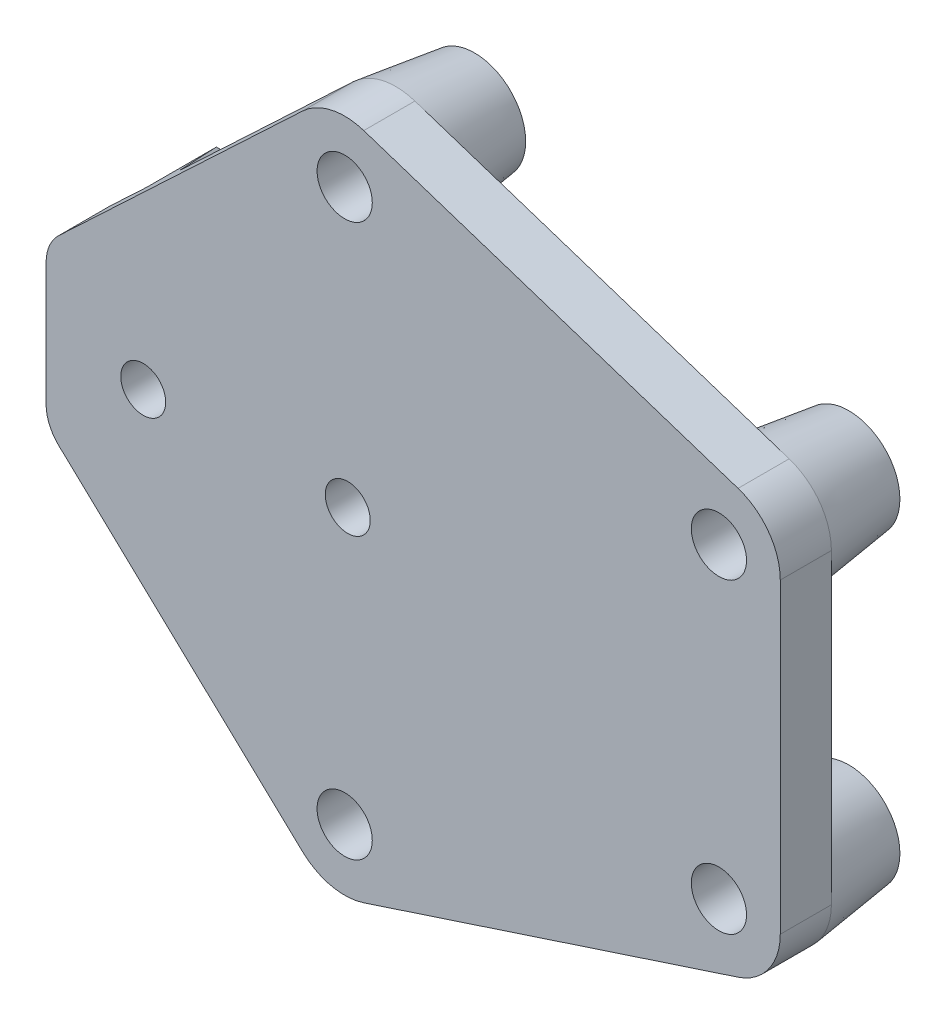
ISO-10303-21;
HEADER;
FILE_DESCRIPTION(('STEP AP214'),'2;1');
FILE_NAME('part.step','',(''),(''),'','','');
FILE_SCHEMA(('AUTOMOTIVE_DESIGN { 1 0 10303 214 1 1 1 1 }'));
ENDSEC;
DATA;
#1=APPLICATION_CONTEXT('core data for automotive mechanical design processes');
#2=APPLICATION_PROTOCOL_DEFINITION('international standard','automotive_design',2000,#1);
#3=PRODUCT_CONTEXT('',#1,'mechanical');
#4=PRODUCT('Part','Part','',(#3));
#5=PRODUCT_RELATED_PRODUCT_CATEGORY('part','',(#4));
#6=PRODUCT_DEFINITION_FORMATION('','',#4);
#7=PRODUCT_DEFINITION_CONTEXT('part definition',#1,'design');
#8=PRODUCT_DEFINITION('design','',#6,#7);
#9=PRODUCT_DEFINITION_SHAPE('','',#8);
#10=(LENGTH_UNIT() NAMED_UNIT(*) SI_UNIT(.MILLI.,.METRE.));
#11=(NAMED_UNIT(*) PLANE_ANGLE_UNIT() SI_UNIT($,.RADIAN.));
#12=(NAMED_UNIT(*) SI_UNIT($,.STERADIAN.) SOLID_ANGLE_UNIT());
#13=UNCERTAINTY_MEASURE_WITH_UNIT(LENGTH_MEASURE(1.E-05),#10,'distance_accuracy_value','');
#14=(GEOMETRIC_REPRESENTATION_CONTEXT(3) GLOBAL_UNCERTAINTY_ASSIGNED_CONTEXT((#13)) GLOBAL_UNIT_ASSIGNED_CONTEXT((#10,
#11,#12)) REPRESENTATION_CONTEXT('',''));
#15=CARTESIAN_POINT('',(0.,0.,0.));
#16=DIRECTION('',(0.,0.,1.));
#17=DIRECTION('',(1.,0.,0.));
#18=AXIS2_PLACEMENT_3D('',#15,#16,#17);
#19=CARTESIAN_POINT('',(0.,0.,0.));
#20=DIRECTION('',(0.,0.,1.));
#21=DIRECTION('',(1.,0.,0.));
#22=AXIS2_PLACEMENT_3D('',#19,#20,#21);
#23=PLANE('',#22);
#24=CARTESIAN_POINT('',(-38.,0.,0.));
#25=DIRECTION('',(0.,0.,1.));
#26=DIRECTION('',(1.,0.,0.));
#27=AXIS2_PLACEMENT_3D('',#24,#25,#26);
#28=CIRCLE('',#27,2.2);
#29=CARTESIAN_POINT('',(-35.8,0.,0.));
#30=VERTEX_POINT('',#29);
#31=EDGE_CURVE('E270',#30,#30,#28,.T.);
#32=ORIENTED_EDGE('',*,*,#31,.T.);
#33=EDGE_LOOP('',(#32));
#34=FACE_BOUND('',#33,.T.);
#35=CARTESIAN_POINT('',(-18.,0.,0.));
#36=DIRECTION('',(0.,0.,1.));
#37=DIRECTION('',(1.,0.,0.));
#38=AXIS2_PLACEMENT_3D('',#35,#36,#37);
#39=CIRCLE('',#38,2.2);
#40=CARTESIAN_POINT('',(-15.8,0.,0.));
#41=VERTEX_POINT('',#40);
#42=EDGE_CURVE('E344',#41,#41,#39,.T.);
#43=ORIENTED_EDGE('',*,*,#42,.T.);
#44=EDGE_LOOP('',(#43));
#45=FACE_BOUND('',#44,.T.);
#46=DIRECTION('',(-0.727760076401564,0.685831809699717,0.));
#47=VECTOR('',#46,1.);
#48=CARTESIAN_POINT('',(-26.1989425971785,-27.8006126232478,0.));
#49=LINE('',#48,#47);
#50=CARTESIAN_POINT('',(-22.4149908581983,-31.3665604584094,0.));
#51=VERTEX_POINT('',#50);
#52=CARTESIAN_POINT('',(-39.4637790615945,-15.3,0.));
#53=VERTEX_POINT('',#52);
#54=EDGE_CURVE('E319',#51,#53,#49,.T.);
#55=ORIENTED_EDGE('',*,*,#54,.T.);
#56=DIRECTION('',(1.,0.,0.));
#57=VECTOR('',#56,1.);
#58=CARTESIAN_POINT('',(-13.,-15.3,0.));
#59=LINE('',#58,#57);
#60=CARTESIAN_POINT('',(-13.,-15.3,0.));
#61=VERTEX_POINT('',#60);
#62=EDGE_CURVE('E183',#53,#61,#59,.T.);
#63=ORIENTED_EDGE('',*,*,#62,.T.);
#64=DIRECTION('',(0.,1.,0.));
#65=VECTOR('',#64,1.);
#66=CARTESIAN_POINT('',(-13.,0.,0.));
#67=LINE('',#66,#65);
#68=CARTESIAN_POINT('',(-13.,-10.3,0.));
#69=VERTEX_POINT('',#68);
#70=EDGE_CURVE('E52',#61,#69,#67,.T.);
#71=ORIENTED_EDGE('',*,*,#70,.T.);
#72=DIRECTION('',(1.,0.,0.));
#73=VECTOR('',#72,1.);
#74=CARTESIAN_POINT('',(0.,-10.3,0.));
#75=LINE('',#74,#73);
#76=CARTESIAN_POINT('',(-42.6471837948346,-10.3,0.));
#77=VERTEX_POINT('',#76);
#78=EDGE_CURVE('E209',#77,#69,#75,.T.);
#79=ORIENTED_EDGE('',*,*,#78,.F.);
#80=DIRECTION('',(0.,1.,0.));
#81=VECTOR('',#80,1.);
#82=CARTESIAN_POINT('',(-42.6471837948345,1.47962141826394E-13,0.));
#83=LINE('',#82,#81);
#84=CARTESIAN_POINT('',(-42.6471837948346,-12.3,0.));
#85=VERTEX_POINT('',#84);
#86=EDGE_CURVE('E212',#85,#77,#83,.T.);
#87=ORIENTED_EDGE('',*,*,#86,.F.);
#88=CARTESIAN_POINT('',(-46.2433272387989,-8.91104030560625,0.));
#89=VERTEX_POINT('',#88);
#90=EDGE_CURVE('E191',#85,#89,#49,.T.);
#91=ORIENTED_EDGE('',*,*,#90,.T.);
#92=CARTESIAN_POINT('',(-43.5,-6.,0.));
#93=DIRECTION('',(0.,0.,1.));
#94=DIRECTION('',(1.,0.,0.));
#95=AXIS2_PLACEMENT_3D('',#92,#93,#94);
#96=CIRCLE('',#95,4.);
#97=CARTESIAN_POINT('',(-47.5,-6.,0.));
#98=VERTEX_POINT('',#97);
#99=EDGE_CURVE('E266',#98,#89,#96,.T.);
#100=ORIENTED_EDGE('',*,*,#99,.F.);
#101=DIRECTION('',(0.,-1.,0.));
#102=VECTOR('',#101,1.);
#103=CARTESIAN_POINT('',(-47.5,0.,0.));
#104=LINE('',#103,#102);
#105=CARTESIAN_POINT('',(-47.5,6.,0.));
#106=VERTEX_POINT('',#105);
#107=EDGE_CURVE('E342',#106,#98,#104,.T.);
#108=ORIENTED_EDGE('',*,*,#107,.F.);
#109=CARTESIAN_POINT('',(-43.5,6.,0.));
#110=DIRECTION('',(0.,0.,1.));
#111=DIRECTION('',(1.,0.,0.));
#112=AXIS2_PLACEMENT_3D('',#109,#110,#111);
#113=CIRCLE('',#112,4.);
#114=CARTESIAN_POINT('',(-46.2433272387989,8.91104030560626,0.));
#115=VERTEX_POINT('',#114);
#116=EDGE_CURVE('E339',#106,#115,#113,.F.);
#117=ORIENTED_EDGE('',*,*,#116,.T.);
#118=DIRECTION('',(-0.727760076401564,-0.685831809699718,0.));
#119=VECTOR('',#118,1.);
#120=CARTESIAN_POINT('',(-26.1989425971786,27.8006126232478,0.));
#121=LINE('',#120,#119);
#122=CARTESIAN_POINT('',(-42.6471837948346,12.3,0.));
#123=VERTEX_POINT('',#122);
#124=EDGE_CURVE('E334',#123,#115,#121,.T.);
#125=ORIENTED_EDGE('',*,*,#124,.F.);
#126=DIRECTION('',(0.,-1.,0.));
#127=VECTOR('',#126,1.);
#128=CARTESIAN_POINT('',(-42.6471837948346,0.,0.));
#129=LINE('',#128,#127);
#130=CARTESIAN_POINT('',(-42.6471837948346,10.3,0.));
#131=VERTEX_POINT('',#130);
#132=EDGE_CURVE('E217',#123,#131,#129,.T.);
#133=ORIENTED_EDGE('',*,*,#132,.T.);
#134=DIRECTION('',(1.,0.,0.));
#135=VECTOR('',#134,1.);
#136=CARTESIAN_POINT('',(0.,10.3,0.));
#137=LINE('',#136,#135);
#138=CARTESIAN_POINT('',(-13.,10.3,0.));
#139=VERTEX_POINT('',#138);
#140=EDGE_CURVE('E234',#131,#139,#137,.T.);
#141=ORIENTED_EDGE('',*,*,#140,.T.);
#142=DIRECTION('',(0.,-1.,0.));
#143=VECTOR('',#142,1.);
#144=CARTESIAN_POINT('',(-13.,0.,0.));
#145=LINE('',#144,#143);
#146=CARTESIAN_POINT('',(-13.,15.3,0.));
#147=VERTEX_POINT('',#146);
#148=EDGE_CURVE('E223',#147,#139,#145,.T.);
#149=ORIENTED_EDGE('',*,*,#148,.F.);
#150=DIRECTION('',(-1.,0.,0.));
#151=VECTOR('',#150,1.);
#152=CARTESIAN_POINT('',(-42.6471837948346,15.3,0.));
#153=LINE('',#152,#151);
#154=CARTESIAN_POINT('',(-39.4637790615945,15.3,0.));
#155=VERTEX_POINT('',#154);
#156=EDGE_CURVE('E412',#147,#155,#153,.T.);
#157=ORIENTED_EDGE('',*,*,#156,.T.);
#158=CARTESIAN_POINT('',(-22.4149908581983,31.3665604584094,0.));
#159=VERTEX_POINT('',#158);
#160=EDGE_CURVE('E336',#159,#155,#121,.T.);
#161=ORIENTED_EDGE('',*,*,#160,.F.);
#162=CARTESIAN_POINT('',(-18.3,27.,0.));
#163=DIRECTION('',(0.,0.,1.));
#164=DIRECTION('',(1.,0.,0.));
#165=AXIS2_PLACEMENT_3D('',#162,#163,#164);
#166=CIRCLE('',#165,6.);
#167=CARTESIAN_POINT('',(-16.4306959849701,32.7013772458411,0.));
#168=VERTEX_POINT('',#167);
#169=EDGE_CURVE('E382',#159,#168,#166,.T.);
#170=ORIENTED_EDGE('',*,*,#169,.T.);
#171=DIRECTION('',(0.950229540973498,-0.311550669171639,0.));
#172=VECTOR('',#171,1.);
#173=CARTESIAN_POINT('',(8.08624165152586,24.6630370371538,0.));
#174=LINE('',#173,#172);
#175=CARTESIAN_POINT('',(20.1693040150298,20.701377245841,0.));
#176=VERTEX_POINT('',#175);
#177=EDGE_CURVE('E335',#168,#176,#174,.T.);
#178=ORIENTED_EDGE('',*,*,#177,.T.);
#179=CARTESIAN_POINT('',(18.3,15.,0.));
#180=DIRECTION('',(0.,0.,1.));
#181=DIRECTION('',(1.,0.,0.));
#182=AXIS2_PLACEMENT_3D('',#179,#180,#181);
#183=CIRCLE('',#182,6.00000000000001);
#184=CARTESIAN_POINT('',(24.3,15.,0.));
#185=VERTEX_POINT('',#184);
#186=EDGE_CURVE('E377',#176,#185,#183,.T.);
#187=ORIENTED_EDGE('',*,*,#186,.T.);
#188=DIRECTION('',(0.,-1.,0.));
#189=VECTOR('',#188,1.);
#190=CARTESIAN_POINT('',(24.3,0.,0.));
#191=LINE('',#190,#189);
#192=CARTESIAN_POINT('',(24.3,-15.,0.));
#193=VERTEX_POINT('',#192);
#194=EDGE_CURVE('E330',#185,#193,#191,.T.);
#195=ORIENTED_EDGE('',*,*,#194,.T.);
#196=CARTESIAN_POINT('',(18.3,-15.,0.));
#197=DIRECTION('',(0.,0.,1.));
#198=DIRECTION('',(1.,0.,0.));
#199=AXIS2_PLACEMENT_3D('',#196,#197,#198);
#200=CIRCLE('',#199,6.00000000000001);
#201=CARTESIAN_POINT('',(20.1693040150298,-20.701377245841,0.));
#202=VERTEX_POINT('',#201);
#203=EDGE_CURVE('E406',#193,#202,#200,.T.);
#204=ORIENTED_EDGE('',*,*,#203,.T.);
#205=DIRECTION('',(-0.950229540973498,-0.311550669171639,0.));
#206=VECTOR('',#205,1.);
#207=CARTESIAN_POINT('',(8.08624165152585,-24.6630370371538,0.));
#208=LINE('',#207,#206);
#209=CARTESIAN_POINT('',(-16.4306959849701,-32.701377245841,0.));
#210=VERTEX_POINT('',#209);
#211=EDGE_CURVE('E324',#202,#210,#208,.T.);
#212=ORIENTED_EDGE('',*,*,#211,.T.);
#213=CARTESIAN_POINT('',(-18.3,-27.,0.));
#214=DIRECTION('',(0.,0.,1.));
#215=DIRECTION('',(1.,0.,0.));
#216=AXIS2_PLACEMENT_3D('',#213,#214,#215);
#217=CIRCLE('',#216,6.);
#218=EDGE_CURVE('E409',#210,#51,#217,.T.);
#219=ORIENTED_EDGE('',*,*,#218,.T.);
#220=EDGE_LOOP('',(#55,#63,#71,#79,#87,#91,#100,#108,#117,#125,#133,#141,#149,#157,#161,#170,
#178,#187,#195,#204,#212,#219));
#221=FACE_BOUND('',#220,.T.);
#222=ADVANCED_FACE('F36',(#34,#45,#221),#23,.F.);
#223=CARTESIAN_POINT('',(-43.5,-6.,5.));
#224=DIRECTION('',(0.,0.,-1.));
#225=DIRECTION('',(-1.,0.,0.));
#226=AXIS2_PLACEMENT_3D('',#223,#224,#225);
#227=CYLINDRICAL_SURFACE('',#226,4.);
#228=ORIENTED_EDGE('',*,*,#99,.T.);
#229=DIRECTION('',(0.,0.,-1.));
#230=VECTOR('',#229,1.);
#231=CARTESIAN_POINT('',(-46.2433272387989,-8.91104030560625,5.));
#232=LINE('',#231,#230);
#233=CARTESIAN_POINT('',(-46.2433272387989,-8.91104030560625,5.));
#234=VERTEX_POINT('',#233);
#235=EDGE_CURVE('E375',#234,#89,#232,.T.);
#236=ORIENTED_EDGE('',*,*,#235,.F.);
#237=CARTESIAN_POINT('',(-43.5,-6.,5.));
#238=DIRECTION('',(0.,0.,1.));
#239=DIRECTION('',(1.,0.,0.));
#240=AXIS2_PLACEMENT_3D('',#237,#238,#239);
#241=CIRCLE('',#240,4.);
#242=CARTESIAN_POINT('',(-47.5,-6.,5.));
#243=VERTEX_POINT('',#242);
#244=EDGE_CURVE('E267',#243,#234,#241,.T.);
#245=ORIENTED_EDGE('',*,*,#244,.F.);
#246=DIRECTION('',(0.,0.,-1.));
#247=VECTOR('',#246,1.);
#248=CARTESIAN_POINT('',(-47.5,-6.,5.));
#249=LINE('',#248,#247);
#250=EDGE_CURVE('E316',#243,#98,#249,.T.);
#251=ORIENTED_EDGE('',*,*,#250,.T.);
#252=EDGE_LOOP('',(#228,#236,#245,#251));
#253=FACE_BOUND('',#252,.T.);
#254=ADVANCED_FACE('F443',(#253),#227,.T.);
#255=CARTESIAN_POINT('',(-26.1989425971785,-27.8006126232478,5.));
#256=DIRECTION('',(-0.685831809699717,-0.727760076401564,0.));
#257=DIRECTION('',(0.727760076401564,-0.685831809699717,0.));
#258=AXIS2_PLACEMENT_3D('',#255,#256,#257);
#259=PLANE('',#258);
#260=ORIENTED_EDGE('',*,*,#54,.F.);
#261=DIRECTION('',(0.,0.,-1.));
#262=VECTOR('',#261,1.);
#263=CARTESIAN_POINT('',(-22.4149908581983,-31.3665604584094,5.));
#264=LINE('',#263,#262);
#265=CARTESIAN_POINT('',(-22.4149908581983,-31.3665604584094,5.));
#266=VERTEX_POINT('',#265);
#267=EDGE_CURVE('E372',#266,#51,#264,.T.);
#268=ORIENTED_EDGE('',*,*,#267,.F.);
#269=DIRECTION('',(-0.727760076401564,0.685831809699717,0.));
#270=VECTOR('',#269,1.);
#271=CARTESIAN_POINT('',(-26.1989425971785,-27.8006126232478,5.));
#272=LINE('',#271,#270);
#273=EDGE_CURVE('E269',#266,#234,#272,.T.);
#274=ORIENTED_EDGE('',*,*,#273,.T.);
#275=ORIENTED_EDGE('',*,*,#235,.T.);
#276=ORIENTED_EDGE('',*,*,#90,.F.);
#277=DIRECTION('',(0.,0.,-1.));
#278=VECTOR('',#277,1.);
#279=CARTESIAN_POINT('',(-42.6471837948346,-12.3,-6.8));
#280=LINE('',#279,#278);
#281=CARTESIAN_POINT('',(-42.6471837948346,-12.3,-6.79999999999997));
#282=VERTEX_POINT('',#281);
#283=EDGE_CURVE('E11',#85,#282,#280,.T.);
#284=ORIENTED_EDGE('',*,*,#283,.T.);
#285=DIRECTION('',(-0.393721481049134,0.37103809980995,-0.841019692902549));
#286=VECTOR('',#285,1.);
#287=CARTESIAN_POINT('',(-36.0361621655216,-18.5301424260787,7.32165616577843));
#288=LINE('',#287,#286);
#289=EDGE_CURVE('E180',#282,#53,#288,.F.);
#290=ORIENTED_EDGE('',*,*,#289,.T.);
#291=EDGE_LOOP('',(#260,#268,#274,#275,#276,#284,#290));
#292=FACE_BOUND('',#291,.T.);
#293=ADVANCED_FACE('F189',(#292),#259,.T.);
#294=CARTESIAN_POINT('',(-18.3,-27.,5.));
#295=DIRECTION('',(0.,0.,-1.));
#296=DIRECTION('',(-1.,0.,0.));
#297=AXIS2_PLACEMENT_3D('',#294,#295,#296);
#298=CYLINDRICAL_SURFACE('',#297,6.);
#299=CARTESIAN_POINT('',(-18.3,-27.,0.));
#300=DIRECTION('',(0.,0.,1.));
#301=DIRECTION('',(1.,0.,0.));
#302=AXIS2_PLACEMENT_3D('',#299,#300,#301);
#303=CIRCLE('',#302,6.);
#304=EDGE_CURVE('E321',#51,#210,#303,.T.);
#305=ORIENTED_EDGE('',*,*,#304,.T.);
#306=DIRECTION('',(0.,0.,-1.));
#307=VECTOR('',#306,1.);
#308=CARTESIAN_POINT('',(-16.4306959849701,-32.701377245841,5.));
#309=LINE('',#308,#307);
#310=CARTESIAN_POINT('',(-16.4306959849701,-32.701377245841,5.));
#311=VERTEX_POINT('',#310);
#312=EDGE_CURVE('E369',#311,#210,#309,.T.);
#313=ORIENTED_EDGE('',*,*,#312,.F.);
#314=CARTESIAN_POINT('',(-18.3,-27.,5.));
#315=DIRECTION('',(0.,0.,1.));
#316=DIRECTION('',(1.,0.,0.));
#317=AXIS2_PLACEMENT_3D('',#314,#315,#316);
#318=CIRCLE('',#317,6.);
#319=EDGE_CURVE('E273',#266,#311,#318,.T.);
#320=ORIENTED_EDGE('',*,*,#319,.F.);
#321=ORIENTED_EDGE('',*,*,#267,.T.);
#322=EDGE_LOOP('',(#305,#313,#320,#321));
#323=FACE_BOUND('',#322,.T.);
#324=ADVANCED_FACE('F432',(#323),#298,.T.);
#325=CARTESIAN_POINT('',(8.08624165152585,-24.6630370371538,5.));
#326=DIRECTION('',(0.311550669171639,-0.950229540973498,0.));
#327=DIRECTION('',(0.950229540973498,0.311550669171639,0.));
#328=AXIS2_PLACEMENT_3D('',#325,#326,#327);
#329=PLANE('',#328);
#330=ORIENTED_EDGE('',*,*,#211,.F.);
#331=DIRECTION('',(0.,0.,-1.));
#332=VECTOR('',#331,1.);
#333=CARTESIAN_POINT('',(20.1693040150298,-20.701377245841,5.));
#334=LINE('',#333,#332);
#335=CARTESIAN_POINT('',(20.1693040150298,-20.701377245841,5.));
#336=VERTEX_POINT('',#335);
#337=EDGE_CURVE('E365',#336,#202,#334,.T.);
#338=ORIENTED_EDGE('',*,*,#337,.F.);
#339=DIRECTION('',(-0.950229540973498,-0.311550669171639,0.));
#340=VECTOR('',#339,1.);
#341=CARTESIAN_POINT('',(8.08624165152585,-24.6630370371538,5.));
#342=LINE('',#341,#340);
#343=EDGE_CURVE('E275',#336,#311,#342,.T.);
#344=ORIENTED_EDGE('',*,*,#343,.T.);
#345=ORIENTED_EDGE('',*,*,#312,.T.);
#346=EDGE_LOOP('',(#330,#338,#344,#345));
#347=FACE_BOUND('',#346,.T.);
#348=ADVANCED_FACE('F545',(#347),#329,.T.);
#349=CARTESIAN_POINT('',(18.3,-15.,5.));
#350=DIRECTION('',(0.,0.,-1.));
#351=DIRECTION('',(-1.,0.,0.));
#352=AXIS2_PLACEMENT_3D('',#349,#350,#351);
#353=CYLINDRICAL_SURFACE('',#352,6.00000000000006);
#354=CARTESIAN_POINT('',(18.3,-15.,0.));
#355=DIRECTION('',(0.,0.,1.));
#356=DIRECTION('',(1.,0.,0.));
#357=AXIS2_PLACEMENT_3D('',#354,#355,#356);
#358=CIRCLE('',#357,6.00000000000006);
#359=EDGE_CURVE('E327',#193,#202,#358,.F.);
#360=ORIENTED_EDGE('',*,*,#359,.F.);
#361=DIRECTION('',(0.,0.,-1.));
#362=VECTOR('',#361,1.);
#363=CARTESIAN_POINT('',(24.3,-15.,5.));
#364=LINE('',#363,#362);
#365=CARTESIAN_POINT('',(24.3,-15.,5.));
#366=VERTEX_POINT('',#365);
#367=EDGE_CURVE('E363',#366,#193,#364,.T.);
#368=ORIENTED_EDGE('',*,*,#367,.F.);
#369=CARTESIAN_POINT('',(18.3,-15.,5.));
#370=DIRECTION('',(0.,0.,1.));
#371=DIRECTION('',(1.,0.,0.));
#372=AXIS2_PLACEMENT_3D('',#369,#370,#371);
#373=CIRCLE('',#372,6.00000000000006);
#374=EDGE_CURVE('E278',#366,#336,#373,.F.);
#375=ORIENTED_EDGE('',*,*,#374,.T.);
#376=ORIENTED_EDGE('',*,*,#337,.T.);
#377=EDGE_LOOP('',(#360,#368,#375,#376));
#378=FACE_BOUND('',#377,.T.);
#379=ADVANCED_FACE('F541',(#378),#353,.T.);
#380=CARTESIAN_POINT('',(24.3,0.,5.));
#381=DIRECTION('',(1.,0.,0.));
#382=DIRECTION('',(0.,0.,-1.));
#383=AXIS2_PLACEMENT_3D('',#380,#381,#382);
#384=PLANE('',#383);
#385=ORIENTED_EDGE('',*,*,#194,.F.);
#386=DIRECTION('',(0.,0.,-1.));
#387=VECTOR('',#386,1.);
#388=CARTESIAN_POINT('',(24.3,15.,5.));
#389=LINE('',#388,#387);
#390=CARTESIAN_POINT('',(24.3,15.,5.));
#391=VERTEX_POINT('',#390);
#392=EDGE_CURVE('E366',#391,#185,#389,.T.);
#393=ORIENTED_EDGE('',*,*,#392,.F.);
#394=DIRECTION('',(0.,-1.,0.));
#395=VECTOR('',#394,1.);
#396=CARTESIAN_POINT('',(24.3,0.,5.));
#397=LINE('',#396,#395);
#398=EDGE_CURVE('E281',#391,#366,#397,.T.);
#399=ORIENTED_EDGE('',*,*,#398,.T.);
#400=ORIENTED_EDGE('',*,*,#367,.T.);
#401=EDGE_LOOP('',(#385,#393,#399,#400));
#402=FACE_BOUND('',#401,.T.);
#403=ADVANCED_FACE('F537',(#402),#384,.T.);
#404=CARTESIAN_POINT('',(18.3,15.,5.));
#405=DIRECTION('',(0.,0.,-1.));
#406=DIRECTION('',(-1.,0.,0.));
#407=AXIS2_PLACEMENT_3D('',#404,#405,#406);
#408=CYLINDRICAL_SURFACE('',#407,6.00000000000006);
#409=CARTESIAN_POINT('',(18.3,15.,0.));
#410=DIRECTION('',(0.,0.,1.));
#411=DIRECTION('',(1.,0.,0.));
#412=AXIS2_PLACEMENT_3D('',#409,#410,#411);
#413=CIRCLE('',#412,6.00000000000006);
#414=EDGE_CURVE('E387',#185,#176,#413,.T.);
#415=ORIENTED_EDGE('',*,*,#414,.T.);
#416=DIRECTION('',(0.,0.,-1.));
#417=VECTOR('',#416,1.);
#418=CARTESIAN_POINT('',(20.1693040150298,20.701377245841,5.));
#419=LINE('',#418,#417);
#420=CARTESIAN_POINT('',(20.1693040150298,20.701377245841,5.));
#421=VERTEX_POINT('',#420);
#422=EDGE_CURVE('E362',#421,#176,#419,.T.);
#423=ORIENTED_EDGE('',*,*,#422,.F.);
#424=CARTESIAN_POINT('',(18.3,15.,5.));
#425=DIRECTION('',(0.,0.,1.));
#426=DIRECTION('',(1.,0.,0.));
#427=AXIS2_PLACEMENT_3D('',#424,#425,#426);
#428=CIRCLE('',#427,6.00000000000006);
#429=EDGE_CURVE('E284',#391,#421,#428,.T.);
#430=ORIENTED_EDGE('',*,*,#429,.F.);
#431=ORIENTED_EDGE('',*,*,#392,.T.);
#432=EDGE_LOOP('',(#415,#423,#430,#431));
#433=FACE_BOUND('',#432,.T.);
#434=ADVANCED_FACE('F533',(#433),#408,.T.);
#435=CARTESIAN_POINT('',(8.08624165152586,24.6630370371538,5.));
#436=DIRECTION('',(0.311550669171639,0.950229540973498,0.));
#437=DIRECTION('',(-0.950229540973498,0.311550669171639,0.));
#438=AXIS2_PLACEMENT_3D('',#435,#436,#437);
#439=PLANE('',#438);
#440=ORIENTED_EDGE('',*,*,#177,.F.);
#441=DIRECTION('',(0.,0.,-1.));
#442=VECTOR('',#441,1.);
#443=CARTESIAN_POINT('',(-16.4306959849701,32.7013772458411,5.));
#444=LINE('',#443,#442);
#445=CARTESIAN_POINT('',(-16.4306959849701,32.7013772458411,5.));
#446=VERTEX_POINT('',#445);
#447=EDGE_CURVE('E359',#446,#168,#444,.T.);
#448=ORIENTED_EDGE('',*,*,#447,.F.);
#449=DIRECTION('',(0.950229540973498,-0.311550669171639,0.));
#450=VECTOR('',#449,1.);
#451=CARTESIAN_POINT('',(8.08624165152586,24.6630370371538,5.));
#452=LINE('',#451,#450);
#453=EDGE_CURVE('E286',#446,#421,#452,.T.);
#454=ORIENTED_EDGE('',*,*,#453,.T.);
#455=ORIENTED_EDGE('',*,*,#422,.T.);
#456=EDGE_LOOP('',(#440,#448,#454,#455));
#457=FACE_BOUND('',#456,.T.);
#458=ADVANCED_FACE('F529',(#457),#439,.T.);
#459=CARTESIAN_POINT('',(-18.3,27.,5.));
#460=DIRECTION('',(0.,0.,-1.));
#461=DIRECTION('',(-1.,0.,0.));
#462=AXIS2_PLACEMENT_3D('',#459,#460,#461);
#463=CYLINDRICAL_SURFACE('',#462,6.00000000000006);
#464=CARTESIAN_POINT('',(-18.3,27.,0.));
#465=DIRECTION('',(0.,0.,1.));
#466=DIRECTION('',(1.,0.,0.));
#467=AXIS2_PLACEMENT_3D('',#464,#465,#466);
#468=CIRCLE('',#467,6.00000000000006);
#469=EDGE_CURVE('E331',#168,#159,#468,.T.);
#470=ORIENTED_EDGE('',*,*,#469,.T.);
#471=DIRECTION('',(0.,0.,-1.));
#472=VECTOR('',#471,1.);
#473=CARTESIAN_POINT('',(-22.4149908581983,31.3665604584094,5.));
#474=LINE('',#473,#472);
#475=CARTESIAN_POINT('',(-22.4149908581983,31.3665604584094,5.));
#476=VERTEX_POINT('',#475);
#477=EDGE_CURVE('E356',#476,#159,#474,.T.);
#478=ORIENTED_EDGE('',*,*,#477,.F.);
#479=CARTESIAN_POINT('',(-18.3,27.,5.));
#480=DIRECTION('',(0.,0.,1.));
#481=DIRECTION('',(1.,0.,0.));
#482=AXIS2_PLACEMENT_3D('',#479,#480,#481);
#483=CIRCLE('',#482,6.00000000000006);
#484=EDGE_CURVE('E289',#446,#476,#483,.T.);
#485=ORIENTED_EDGE('',*,*,#484,.F.);
#486=ORIENTED_EDGE('',*,*,#447,.T.);
#487=EDGE_LOOP('',(#470,#478,#485,#486));
#488=FACE_BOUND('',#487,.T.);
#489=ADVANCED_FACE('F526',(#488),#463,.T.);
#490=CARTESIAN_POINT('',(-26.1989425971786,27.8006126232478,5.));
#491=DIRECTION('',(0.685831809699718,-0.727760076401564,0.));
#492=DIRECTION('',(0.727760076401564,0.685831809699718,0.));
#493=AXIS2_PLACEMENT_3D('',#490,#491,#492);
#494=PLANE('',#493);
#495=ORIENTED_EDGE('',*,*,#160,.T.);
#496=DIRECTION('',(0.393721481049134,0.371038099809951,0.841019692902549));
#497=VECTOR('',#496,1.);
#498=CARTESIAN_POINT('',(-33.9257111836137,20.5190045018349,11.8297435374923));
#499=LINE('',#498,#497);
#500=CARTESIAN_POINT('',(-42.6471837948346,12.3,-6.8));
#501=VERTEX_POINT('',#500);
#502=EDGE_CURVE('E417',#155,#501,#499,.F.);
#503=ORIENTED_EDGE('',*,*,#502,.T.);
#504=DIRECTION('',(0.,0.,-1.));
#505=VECTOR('',#504,1.);
#506=CARTESIAN_POINT('',(-42.6471837948346,12.3,5.));
#507=LINE('',#506,#505);
#508=EDGE_CURVE('E420',#123,#501,#507,.T.);
#509=ORIENTED_EDGE('',*,*,#508,.F.);
#510=ORIENTED_EDGE('',*,*,#124,.T.);
#511=DIRECTION('',(0.,0.,-1.));
#512=VECTOR('',#511,1.);
#513=CARTESIAN_POINT('',(-46.2433272387989,8.91104030560626,5.));
#514=LINE('',#513,#512);
#515=CARTESIAN_POINT('',(-46.2433272387989,8.91104030560626,5.));
#516=VERTEX_POINT('',#515);
#517=EDGE_CURVE('E353',#516,#115,#514,.T.);
#518=ORIENTED_EDGE('',*,*,#517,.F.);
#519=DIRECTION('',(-0.727760076401564,-0.685831809699718,0.));
#520=VECTOR('',#519,1.);
#521=CARTESIAN_POINT('',(-26.1989425971786,27.8006126232478,5.));
#522=LINE('',#521,#520);
#523=EDGE_CURVE('E291',#476,#516,#522,.T.);
#524=ORIENTED_EDGE('',*,*,#523,.F.);
#525=ORIENTED_EDGE('',*,*,#477,.T.);
#526=EDGE_LOOP('',(#495,#503,#509,#510,#518,#524,#525));
#527=FACE_BOUND('',#526,.T.);
#528=ADVANCED_FACE('F454',(#527),#494,.F.);
#529=CARTESIAN_POINT('',(-43.5,6.,5.));
#530=DIRECTION('',(0.,0.,-1.));
#531=DIRECTION('',(-1.,0.,0.));
#532=AXIS2_PLACEMENT_3D('',#529,#530,#531);
#533=CYLINDRICAL_SURFACE('',#532,4.);
#534=ORIENTED_EDGE('',*,*,#116,.F.);
#535=DIRECTION('',(0.,0.,-1.));
#536=VECTOR('',#535,1.);
#537=CARTESIAN_POINT('',(-47.5,6.,5.));
#538=LINE('',#537,#536);
#539=CARTESIAN_POINT('',(-47.5,6.,5.));
#540=VERTEX_POINT('',#539);
#541=EDGE_CURVE('E351',#540,#106,#538,.T.);
#542=ORIENTED_EDGE('',*,*,#541,.F.);
#543=CARTESIAN_POINT('',(-43.5,6.,5.));
#544=DIRECTION('',(0.,0.,1.));
#545=DIRECTION('',(1.,0.,0.));
#546=AXIS2_PLACEMENT_3D('',#543,#544,#545);
#547=CIRCLE('',#546,4.);
#548=EDGE_CURVE('E293',#540,#516,#547,.F.);
#549=ORIENTED_EDGE('',*,*,#548,.T.);
#550=ORIENTED_EDGE('',*,*,#517,.T.);
#551=EDGE_LOOP('',(#534,#542,#549,#550));
#552=FACE_BOUND('',#551,.T.);
#553=ADVANCED_FACE('F450',(#552),#533,.T.);
#554=CARTESIAN_POINT('',(18.3,-15.,5.));
#555=DIRECTION('',(0.,0.,-1.));
#556=DIRECTION('',(-1.,0.,0.));
#557=AXIS2_PLACEMENT_3D('',#554,#555,#556);
#558=CYLINDRICAL_SURFACE('',#557,2.7);
#559=CARTESIAN_POINT('',(18.3,-15.,5.));
#560=DIRECTION('',(0.,0.,1.));
#561=DIRECTION('',(1.,0.,0.));
#562=AXIS2_PLACEMENT_3D('',#559,#560,#561);
#563=CIRCLE('',#562,2.7);
#564=CARTESIAN_POINT('',(21.,-15.,5.));
#565=VERTEX_POINT('',#564);
#566=EDGE_CURVE('E310',#565,#565,#563,.F.);
#567=ORIENTED_EDGE('',*,*,#566,.F.);
#568=EDGE_LOOP('',(#567));
#569=FACE_BOUND('',#568,.T.);
#570=CARTESIAN_POINT('',(18.3,-15.,-7.7));
#571=DIRECTION('',(0.,0.,-1.));
#572=DIRECTION('',(1.,0.,0.));
#573=AXIS2_PLACEMENT_3D('',#570,#571,#572);
#574=CIRCLE('',#573,2.70000000000001);
#575=CARTESIAN_POINT('',(21.,-15.,-7.7));
#576=VERTEX_POINT('',#575);
#577=EDGE_CURVE('E248',#576,#576,#574,.T.);
#578=ORIENTED_EDGE('',*,*,#577,.T.);
#579=EDGE_LOOP('',(#578));
#580=FACE_BOUND('',#579,.T.);
#581=ADVANCED_FACE('F500',(#569,#580),#558,.F.);
#582=CARTESIAN_POINT('',(18.3,15.,5.));
#583=DIRECTION('',(0.,0.,-1.));
#584=DIRECTION('',(-1.,0.,0.));
#585=AXIS2_PLACEMENT_3D('',#582,#583,#584);
#586=CYLINDRICAL_SURFACE('',#585,2.7);
#587=CARTESIAN_POINT('',(18.3,15.,5.));
#588=DIRECTION('',(0.,0.,1.));
#589=DIRECTION('',(1.,0.,0.));
#590=AXIS2_PLACEMENT_3D('',#587,#588,#589);
#591=CIRCLE('',#590,2.7);
#592=CARTESIAN_POINT('',(21.,15.,5.));
#593=VERTEX_POINT('',#592);
#594=EDGE_CURVE('E307',#593,#593,#591,.T.);
#595=ORIENTED_EDGE('',*,*,#594,.T.);
#596=EDGE_LOOP('',(#595));
#597=FACE_BOUND('',#596,.T.);
#598=CARTESIAN_POINT('',(18.3,15.,-7.7));
#599=DIRECTION('',(0.,0.,1.));
#600=DIRECTION('',(1.,0.,0.));
#601=AXIS2_PLACEMENT_3D('',#598,#599,#600);
#602=CIRCLE('',#601,2.70000000000001);
#603=CARTESIAN_POINT('',(21.,15.,-7.7));
#604=VERTEX_POINT('',#603);
#605=EDGE_CURVE('E260',#604,#604,#602,.T.);
#606=ORIENTED_EDGE('',*,*,#605,.F.);
#607=EDGE_LOOP('',(#606));
#608=FACE_BOUND('',#607,.T.);
#609=ADVANCED_FACE('F503',(#597,#608),#586,.F.);
#610=CARTESIAN_POINT('',(-38.,0.,5.));
#611=DIRECTION('',(0.,0.,-1.));
#612=DIRECTION('',(-1.,0.,0.));
#613=AXIS2_PLACEMENT_3D('',#610,#611,#612);
#614=CYLINDRICAL_SURFACE('',#613,2.2);
#615=CARTESIAN_POINT('',(-38.,0.,5.));
#616=DIRECTION('',(0.,0.,1.));
#617=DIRECTION('',(1.,0.,0.));
#618=AXIS2_PLACEMENT_3D('',#615,#616,#617);
#619=CIRCLE('',#618,2.2);
#620=CARTESIAN_POINT('',(-35.8,0.,5.));
#621=VERTEX_POINT('',#620);
#622=EDGE_CURVE('E304',#621,#621,#619,.T.);
#623=ORIENTED_EDGE('',*,*,#622,.T.);
#624=EDGE_LOOP('',(#623));
#625=FACE_BOUND('',#624,.T.);
#626=ORIENTED_EDGE('',*,*,#31,.F.);
#627=EDGE_LOOP('',(#626));
#628=FACE_BOUND('',#627,.T.);
#629=ADVANCED_FACE('F507',(#625,#628),#614,.F.);
#630=CARTESIAN_POINT('',(-18.,0.,5.));
#631=DIRECTION('',(0.,0.,-1.));
#632=DIRECTION('',(-1.,0.,0.));
#633=AXIS2_PLACEMENT_3D('',#630,#631,#632);
#634=CYLINDRICAL_SURFACE('',#633,2.2);
#635=CARTESIAN_POINT('',(-18.,0.,5.));
#636=DIRECTION('',(0.,0.,1.));
#637=DIRECTION('',(1.,0.,0.));
#638=AXIS2_PLACEMENT_3D('',#635,#636,#637);
#639=CIRCLE('',#638,2.2);
#640=CARTESIAN_POINT('',(-15.8,0.,5.));
#641=VERTEX_POINT('',#640);
#642=EDGE_CURVE('E301',#641,#641,#639,.T.);
#643=ORIENTED_EDGE('',*,*,#642,.T.);
#644=EDGE_LOOP('',(#643));
#645=FACE_BOUND('',#644,.T.);
#646=ORIENTED_EDGE('',*,*,#42,.F.);
#647=EDGE_LOOP('',(#646));
#648=FACE_BOUND('',#647,.T.);
#649=ADVANCED_FACE('F511',(#645,#648),#634,.F.);
#650=CARTESIAN_POINT('',(-18.3,27.,5.));
#651=DIRECTION('',(0.,0.,-1.));
#652=DIRECTION('',(-1.,0.,0.));
#653=AXIS2_PLACEMENT_3D('',#650,#651,#652);
#654=CYLINDRICAL_SURFACE('',#653,2.7);
#655=CARTESIAN_POINT('',(-18.3,27.,5.));
#656=DIRECTION('',(0.,0.,1.));
#657=DIRECTION('',(1.,0.,0.));
#658=AXIS2_PLACEMENT_3D('',#655,#656,#657);
#659=CIRCLE('',#658,2.7);
#660=CARTESIAN_POINT('',(-15.6,27.,5.));
#661=VERTEX_POINT('',#660);
#662=EDGE_CURVE('E298',#661,#661,#659,.T.);
#663=ORIENTED_EDGE('',*,*,#662,.T.);
#664=EDGE_LOOP('',(#663));
#665=FACE_BOUND('',#664,.T.);
#666=CARTESIAN_POINT('',(-18.3,27.,-7.7));
#667=DIRECTION('',(0.,0.,1.));
#668=DIRECTION('',(1.,0.,0.));
#669=AXIS2_PLACEMENT_3D('',#666,#667,#668);
#670=CIRCLE('',#669,2.70000000000001);
#671=CARTESIAN_POINT('',(-15.6,27.,-7.7));
#672=VERTEX_POINT('',#671);
#673=EDGE_CURVE('E254',#672,#672,#670,.T.);
#674=ORIENTED_EDGE('',*,*,#673,.F.);
#675=EDGE_LOOP('',(#674));
#676=FACE_BOUND('',#675,.T.);
#677=ADVANCED_FACE('F515',(#665,#676),#654,.F.);
#678=CARTESIAN_POINT('',(-47.5,0.,5.));
#679=DIRECTION('',(1.,0.,0.));
#680=DIRECTION('',(0.,1.,0.));
#681=AXIS2_PLACEMENT_3D('',#678,#679,#680);
#682=PLANE('',#681);
#683=ORIENTED_EDGE('',*,*,#107,.T.);
#684=ORIENTED_EDGE('',*,*,#250,.F.);
#685=DIRECTION('',(0.,-1.,0.));
#686=VECTOR('',#685,1.);
#687=CARTESIAN_POINT('',(-47.5,0.,5.));
#688=LINE('',#687,#686);
#689=EDGE_CURVE('E296',#540,#243,#688,.T.);
#690=ORIENTED_EDGE('',*,*,#689,.F.);
#691=ORIENTED_EDGE('',*,*,#541,.T.);
#692=EDGE_LOOP('',(#683,#684,#690,#691));
#693=FACE_BOUND('',#692,.T.);
#694=ADVANCED_FACE('F498',(#693),#682,.F.);
#695=CARTESIAN_POINT('',(-18.3,-27.,5.));
#696=DIRECTION('',(0.,0.,-1.));
#697=DIRECTION('',(-1.,0.,0.));
#698=AXIS2_PLACEMENT_3D('',#695,#696,#697);
#699=CYLINDRICAL_SURFACE('',#698,2.7);
#700=CARTESIAN_POINT('',(-18.3,-27.,5.));
#701=DIRECTION('',(0.,0.,1.));
#702=DIRECTION('',(1.,0.,0.));
#703=AXIS2_PLACEMENT_3D('',#700,#701,#702);
#704=CIRCLE('',#703,2.7);
#705=CARTESIAN_POINT('',(-15.6,-27.,5.));
#706=VERTEX_POINT('',#705);
#707=EDGE_CURVE('E313',#706,#706,#704,.T.);
#708=ORIENTED_EDGE('',*,*,#707,.T.);
#709=EDGE_LOOP('',(#708));
#710=FACE_BOUND('',#709,.T.);
#711=CARTESIAN_POINT('',(-18.3,-27.,-7.7));
#712=DIRECTION('',(0.,0.,-1.));
#713=DIRECTION('',(1.,0.,0.));
#714=AXIS2_PLACEMENT_3D('',#711,#712,#713);
#715=CIRCLE('',#714,2.70000000000001);
#716=CARTESIAN_POINT('',(-15.6,-27.,-7.7));
#717=VERTEX_POINT('',#716);
#718=EDGE_CURVE('E241',#717,#717,#715,.T.);
#719=ORIENTED_EDGE('',*,*,#718,.T.);
#720=EDGE_LOOP('',(#719));
#721=FACE_BOUND('',#720,.T.);
#722=ADVANCED_FACE('F495',(#710,#721),#699,.F.);
#723=CARTESIAN_POINT('',(0.,0.,5.));
#724=DIRECTION('',(0.,0.,1.));
#725=DIRECTION('',(1.,0.,0.));
#726=AXIS2_PLACEMENT_3D('',#723,#724,#725);
#727=PLANE('',#726);
#728=ORIENTED_EDGE('',*,*,#244,.T.);
#729=ORIENTED_EDGE('',*,*,#273,.F.);
#730=ORIENTED_EDGE('',*,*,#319,.T.);
#731=ORIENTED_EDGE('',*,*,#343,.F.);
#732=ORIENTED_EDGE('',*,*,#374,.F.);
#733=ORIENTED_EDGE('',*,*,#398,.F.);
#734=ORIENTED_EDGE('',*,*,#429,.T.);
#735=ORIENTED_EDGE('',*,*,#453,.F.);
#736=ORIENTED_EDGE('',*,*,#484,.T.);
#737=ORIENTED_EDGE('',*,*,#523,.T.);
#738=ORIENTED_EDGE('',*,*,#548,.F.);
#739=ORIENTED_EDGE('',*,*,#689,.T.);
#740=EDGE_LOOP('',(#728,#729,#730,#731,#732,#733,#734,#735,#736,#737,#738,#739));
#741=FACE_BOUND('',#740,.T.);
#742=ORIENTED_EDGE('',*,*,#662,.F.);
#743=EDGE_LOOP('',(#742));
#744=FACE_BOUND('',#743,.T.);
#745=ORIENTED_EDGE('',*,*,#642,.F.);
#746=EDGE_LOOP('',(#745));
#747=FACE_BOUND('',#746,.T.);
#748=ORIENTED_EDGE('',*,*,#622,.F.);
#749=EDGE_LOOP('',(#748));
#750=FACE_BOUND('',#749,.T.);
#751=ORIENTED_EDGE('',*,*,#594,.F.);
#752=EDGE_LOOP('',(#751));
#753=FACE_BOUND('',#752,.T.);
#754=ORIENTED_EDGE('',*,*,#566,.T.);
#755=EDGE_LOOP('',(#754));
#756=FACE_BOUND('',#755,.T.);
#757=ORIENTED_EDGE('',*,*,#707,.F.);
#758=EDGE_LOOP('',(#757));
#759=FACE_BOUND('',#758,.T.);
#760=ADVANCED_FACE('F435',(#741,#744,#747,#750,#753,#756,#759),#727,.T.);
#761=CARTESIAN_POINT('',(6.216937636496,18.9616597913128,-7.7));
#762=DIRECTION('',(0.,0.,-1.));
#763=DIRECTION('',(-1.,0.,0.));
#764=AXIS2_PLACEMENT_3D('',#761,#762,#763);
#765=PLANE('',#764);
#766=ORIENTED_EDGE('',*,*,#605,.T.);
#767=EDGE_LOOP('',(#766));
#768=FACE_BOUND('',#767,.T.);
#769=CARTESIAN_POINT('',(18.3,15.,-7.7));
#770=DIRECTION('',(0.,0.,1.));
#771=DIRECTION('',(1.,0.,0.));
#772=AXIS2_PLACEMENT_3D('',#769,#770,#771);
#773=CIRCLE('',#772,5.);
#774=CARTESIAN_POINT('',(23.3,15.,-7.7));
#775=VERTEX_POINT('',#774);
#776=EDGE_CURVE('E263',#775,#775,#773,.T.);
#777=ORIENTED_EDGE('',*,*,#776,.F.);
#778=EDGE_LOOP('',(#777));
#779=FACE_BOUND('',#778,.T.);
#780=ADVANCED_FACE('F683',(#768,#779),#765,.T.);
#781=CARTESIAN_POINT('',(18.3,15.,0.));
#782=DIRECTION('',(0.,0.,1.));
#783=DIRECTION('',(1.,0.,0.));
#784=AXIS2_PLACEMENT_3D('',#781,#782,#783);
#785=CONICAL_SURFACE('',#784,6.00000000000001,0.129147290128021);
#786=ORIENTED_EDGE('',*,*,#776,.T.);
#787=EDGE_LOOP('',(#786));
#788=FACE_BOUND('',#787,.T.);
#789=ORIENTED_EDGE('',*,*,#414,.F.);
#790=ORIENTED_EDGE('',*,*,#186,.F.);
#791=EDGE_LOOP('',(#789,#790));
#792=FACE_BOUND('',#791,.T.);
#793=ADVANCED_FACE('F688',(#788,#792),#785,.T.);
#794=CARTESIAN_POINT('',(6.216937636496,18.9616597913128,-7.7));
#795=DIRECTION('',(0.,0.,-1.));
#796=DIRECTION('',(-1.,0.,0.));
#797=AXIS2_PLACEMENT_3D('',#794,#795,#796);
#798=PLANE('',#797);
#799=ORIENTED_EDGE('',*,*,#673,.T.);
#800=EDGE_LOOP('',(#799));
#801=FACE_BOUND('',#800,.T.);
#802=CARTESIAN_POINT('',(-18.3,27.,-7.7));
#803=DIRECTION('',(0.,0.,1.));
#804=DIRECTION('',(1.,0.,0.));
#805=AXIS2_PLACEMENT_3D('',#802,#803,#804);
#806=CIRCLE('',#805,5.);
#807=CARTESIAN_POINT('',(-13.3,27.,-7.7));
#808=VERTEX_POINT('',#807);
#809=EDGE_CURVE('E257',#808,#808,#806,.T.);
#810=ORIENTED_EDGE('',*,*,#809,.F.);
#811=EDGE_LOOP('',(#810));
#812=FACE_BOUND('',#811,.T.);
#813=ADVANCED_FACE('F694',(#801,#812),#798,.T.);
#814=CARTESIAN_POINT('',(-18.3,27.,0.));
#815=DIRECTION('',(0.,0.,1.));
#816=DIRECTION('',(1.,0.,0.));
#817=AXIS2_PLACEMENT_3D('',#814,#815,#816);
#818=CONICAL_SURFACE('',#817,6.,0.12914729012802);
#819=ORIENTED_EDGE('',*,*,#809,.T.);
#820=EDGE_LOOP('',(#819));
#821=FACE_BOUND('',#820,.T.);
#822=ORIENTED_EDGE('',*,*,#469,.F.);
#823=ORIENTED_EDGE('',*,*,#169,.F.);
#824=EDGE_LOOP('',(#822,#823));
#825=FACE_BOUND('',#824,.T.);
#826=ADVANCED_FACE('F701',(#821,#825),#818,.T.);
#827=CARTESIAN_POINT('',(6.216937636496,-18.9616597913128,-7.7));
#828=DIRECTION('',(0.,0.,-1.));
#829=DIRECTION('',(-1.,0.,0.));
#830=AXIS2_PLACEMENT_3D('',#827,#828,#829);
#831=PLANE('',#830);
#832=ORIENTED_EDGE('',*,*,#577,.F.);
#833=EDGE_LOOP('',(#832));
#834=FACE_BOUND('',#833,.T.);
#835=CARTESIAN_POINT('',(18.3,-15.,-7.7));
#836=DIRECTION('',(0.,0.,-1.));
#837=DIRECTION('',(1.,0.,0.));
#838=AXIS2_PLACEMENT_3D('',#835,#836,#837);
#839=CIRCLE('',#838,5.);
#840=CARTESIAN_POINT('',(23.3,-15.,-7.7));
#841=VERTEX_POINT('',#840);
#842=EDGE_CURVE('E251',#841,#841,#839,.T.);
#843=ORIENTED_EDGE('',*,*,#842,.T.);
#844=EDGE_LOOP('',(#843));
#845=FACE_BOUND('',#844,.T.);
#846=ADVANCED_FACE('F708',(#834,#845),#831,.T.);
#847=CARTESIAN_POINT('',(18.3,-15.,0.));
#848=DIRECTION('',(0.,0.,1.));
#849=DIRECTION('',(1.,0.,0.));
#850=AXIS2_PLACEMENT_3D('',#847,#848,#849);
#851=CONICAL_SURFACE('',#850,6.00000000000001,0.129147290128021);
#852=ORIENTED_EDGE('',*,*,#842,.F.);
#853=EDGE_LOOP('',(#852));
#854=FACE_BOUND('',#853,.T.);
#855=ORIENTED_EDGE('',*,*,#359,.T.);
#856=ORIENTED_EDGE('',*,*,#203,.F.);
#857=EDGE_LOOP('',(#855,#856));
#858=FACE_BOUND('',#857,.T.);
#859=ADVANCED_FACE('F715',(#854,#858),#851,.T.);
#860=CARTESIAN_POINT('',(6.216937636496,-18.9616597913128,-7.7));
#861=DIRECTION('',(0.,0.,-1.));
#862=DIRECTION('',(-1.,0.,0.));
#863=AXIS2_PLACEMENT_3D('',#860,#861,#862);
#864=PLANE('',#863);
#865=ORIENTED_EDGE('',*,*,#718,.F.);
#866=EDGE_LOOP('',(#865));
#867=FACE_BOUND('',#866,.T.);
#868=CARTESIAN_POINT('',(-18.3,-27.,-7.7));
#869=DIRECTION('',(0.,0.,-1.));
#870=DIRECTION('',(1.,0.,0.));
#871=AXIS2_PLACEMENT_3D('',#868,#869,#870);
#872=CIRCLE('',#871,5.);
#873=CARTESIAN_POINT('',(-13.3,-27.,-7.7));
#874=VERTEX_POINT('',#873);
#875=EDGE_CURVE('E245',#874,#874,#872,.T.);
#876=ORIENTED_EDGE('',*,*,#875,.T.);
#877=EDGE_LOOP('',(#876));
#878=FACE_BOUND('',#877,.T.);
#879=ADVANCED_FACE('F723',(#867,#878),#864,.T.);
#880=CARTESIAN_POINT('',(-18.3,-27.,0.));
#881=DIRECTION('',(0.,0.,1.));
#882=DIRECTION('',(1.,0.,0.));
#883=AXIS2_PLACEMENT_3D('',#880,#881,#882);
#884=CONICAL_SURFACE('',#883,6.,0.12914729012802);
#885=ORIENTED_EDGE('',*,*,#875,.F.);
#886=EDGE_LOOP('',(#885));
#887=FACE_BOUND('',#886,.T.);
#888=ORIENTED_EDGE('',*,*,#304,.F.);
#889=ORIENTED_EDGE('',*,*,#218,.F.);
#890=EDGE_LOOP('',(#888,#889));
#891=FACE_BOUND('',#890,.T.);
#892=ADVANCED_FACE('F731',(#887,#891),#884,.T.);
#893=CARTESIAN_POINT('',(-42.6471837948346,0.,-6.8));
#894=DIRECTION('',(-1.,0.,0.));
#895=DIRECTION('',(0.,0.,1.));
#896=AXIS2_PLACEMENT_3D('',#893,#894,#895);
#897=PLANE('',#896);
#898=ORIENTED_EDGE('',*,*,#132,.F.);
#899=ORIENTED_EDGE('',*,*,#508,.T.);
#900=DIRECTION('',(0.,-1.,0.));
#901=VECTOR('',#900,1.);
#902=CARTESIAN_POINT('',(-42.6471837948346,0.,-6.8));
#903=LINE('',#902,#901);
#904=CARTESIAN_POINT('',(-42.6471837948346,10.3,-6.8));
#905=VERTEX_POINT('',#904);
#906=EDGE_CURVE('E219',#501,#905,#903,.T.);
#907=ORIENTED_EDGE('',*,*,#906,.T.);
#908=DIRECTION('',(0.,0.,1.));
#909=VECTOR('',#908,1.);
#910=CARTESIAN_POINT('',(-42.6471837948346,10.3,-6.8));
#911=LINE('',#910,#909);
#912=EDGE_CURVE('E231',#905,#131,#911,.T.);
#913=ORIENTED_EDGE('',*,*,#912,.T.);
#914=EDGE_LOOP('',(#898,#899,#907,#913));
#915=FACE_BOUND('',#914,.T.);
#916=ADVANCED_FACE('F458',(#915),#897,.T.);
#917=CARTESIAN_POINT('',(-13.,0.,-6.8));
#918=DIRECTION('',(-1.,0.,0.));
#919=DIRECTION('',(0.,0.,1.));
#920=AXIS2_PLACEMENT_3D('',#917,#918,#919);
#921=PLANE('',#920);
#922=ORIENTED_EDGE('',*,*,#148,.T.);
#923=DIRECTION('',(0.,0.,1.));
#924=VECTOR('',#923,1.);
#925=CARTESIAN_POINT('',(-13.,10.3,-6.8));
#926=LINE('',#925,#924);
#927=CARTESIAN_POINT('',(-13.,10.3,-6.8));
#928=VERTEX_POINT('',#927);
#929=EDGE_CURVE('E238',#928,#139,#926,.T.);
#930=ORIENTED_EDGE('',*,*,#929,.F.);
#931=DIRECTION('',(0.,-1.,0.));
#932=VECTOR('',#931,1.);
#933=CARTESIAN_POINT('',(-13.,0.,-6.8));
#934=LINE('',#933,#932);
#935=CARTESIAN_POINT('',(-13.,12.3,-6.8));
#936=VERTEX_POINT('',#935);
#937=EDGE_CURVE('E226',#936,#928,#934,.T.);
#938=ORIENTED_EDGE('',*,*,#937,.F.);
#939=DIRECTION('',(0.,-0.403640206576296,-0.914917801572931));
#940=VECTOR('',#939,1.);
#941=CARTESIAN_POINT('',(-13.,10.296017378711,-11.3423606082549));
#942=LINE('',#941,#940);
#943=EDGE_CURVE('E414',#936,#147,#942,.F.);
#944=ORIENTED_EDGE('',*,*,#943,.T.);
#945=EDGE_LOOP('',(#922,#930,#938,#944));
#946=FACE_BOUND('',#945,.T.);
#947=ADVANCED_FACE('F466',(#946),#921,.F.);
#948=CARTESIAN_POINT('',(0.,10.3,-6.8));
#949=DIRECTION('',(0.,-1.,0.));
#950=DIRECTION('',(0.,0.,-1.));
#951=AXIS2_PLACEMENT_3D('',#948,#949,#950);
#952=PLANE('',#951);
#953=ORIENTED_EDGE('',*,*,#140,.F.);
#954=ORIENTED_EDGE('',*,*,#912,.F.);
#955=DIRECTION('',(1.,0.,0.));
#956=VECTOR('',#955,1.);
#957=CARTESIAN_POINT('',(0.,10.3,-6.8));
#958=LINE('',#957,#956);
#959=EDGE_CURVE('E222',#905,#928,#958,.T.);
#960=ORIENTED_EDGE('',*,*,#959,.T.);
#961=ORIENTED_EDGE('',*,*,#929,.T.);
#962=EDGE_LOOP('',(#953,#954,#960,#961));
#963=FACE_BOUND('',#962,.T.);
#964=ADVANCED_FACE('F462',(#963),#952,.T.);
#965=CARTESIAN_POINT('',(0.,0.,-6.8));
#966=DIRECTION('',(0.,0.,1.));
#967=DIRECTION('',(1.,0.,0.));
#968=AXIS2_PLACEMENT_3D('',#965,#966,#967);
#969=PLANE('',#968);
#970=ORIENTED_EDGE('',*,*,#906,.F.);
#971=DIRECTION('',(1.,0.,0.));
#972=VECTOR('',#971,1.);
#973=CARTESIAN_POINT('',(0.,12.3,-6.8));
#974=LINE('',#973,#972);
#975=EDGE_CURVE('E228',#501,#936,#974,.T.);
#976=ORIENTED_EDGE('',*,*,#975,.T.);
#977=ORIENTED_EDGE('',*,*,#937,.T.);
#978=ORIENTED_EDGE('',*,*,#959,.F.);
#979=EDGE_LOOP('',(#970,#976,#977,#978));
#980=FACE_BOUND('',#979,.T.);
#981=ADVANCED_FACE('F474',(#980),#969,.F.);
#982=CARTESIAN_POINT('',(0.,-10.3,-6.8));
#983=DIRECTION('',(0.,-1.,0.));
#984=DIRECTION('',(1.,0.,0.));
#985=AXIS2_PLACEMENT_3D('',#982,#983,#984);
#986=PLANE('',#985);
#987=ORIENTED_EDGE('',*,*,#78,.T.);
#988=DIRECTION('',(0.,0.,1.));
#989=VECTOR('',#988,1.);
#990=CARTESIAN_POINT('',(-13.,-10.3,-6.8));
#991=LINE('',#990,#989);
#992=CARTESIAN_POINT('',(-13.,-10.3,-6.8));
#993=VERTEX_POINT('',#992);
#994=EDGE_CURVE('E215',#993,#69,#991,.T.);
#995=ORIENTED_EDGE('',*,*,#994,.F.);
#996=DIRECTION('',(1.,0.,0.));
#997=VECTOR('',#996,1.);
#998=CARTESIAN_POINT('',(0.,-10.3,-6.8));
#999=LINE('',#998,#997);
#1000=CARTESIAN_POINT('',(-42.6471837948346,-10.3,-6.8));
#1001=VERTEX_POINT('',#1000);
#1002=EDGE_CURVE('E204',#1001,#993,#999,.T.);
#1003=ORIENTED_EDGE('',*,*,#1002,.F.);
#1004=DIRECTION('',(0.,0.,1.));
#1005=VECTOR('',#1004,1.);
#1006=CARTESIAN_POINT('',(-42.6471837948346,-10.3,-6.8));
#1007=LINE('',#1006,#1005);
#1008=EDGE_CURVE('E202',#1001,#77,#1007,.T.);
#1009=ORIENTED_EDGE('',*,*,#1008,.T.);
#1010=EDGE_LOOP('',(#987,#995,#1003,#1009));
#1011=FACE_BOUND('',#1010,.T.);
#1012=ADVANCED_FACE('F426',(#1011),#986,.F.);
#1013=CARTESIAN_POINT('',(-13.,0.,-6.8));
#1014=DIRECTION('',(1.,0.,0.));
#1015=DIRECTION('',(0.,0.,-1.));
#1016=AXIS2_PLACEMENT_3D('',#1013,#1014,#1015);
#1017=PLANE('',#1016);
#1018=ORIENTED_EDGE('',*,*,#70,.F.);
#1019=DIRECTION('',(0.,-0.403640206576295,0.914917801572931));
#1020=VECTOR('',#1019,1.);
#1021=CARTESIAN_POINT('',(-13.,-12.3,-6.79999999999995));
#1022=LINE('',#1021,#1020);
#1023=CARTESIAN_POINT('',(-13.,-12.3,-6.8));
#1024=VERTEX_POINT('',#1023);
#1025=EDGE_CURVE('E45',#61,#1024,#1022,.F.);
#1026=ORIENTED_EDGE('',*,*,#1025,.T.);
#1027=DIRECTION('',(0.,1.,0.));
#1028=VECTOR('',#1027,1.);
#1029=CARTESIAN_POINT('',(-13.,0.,-6.8));
#1030=LINE('',#1029,#1028);
#1031=EDGE_CURVE('E198',#1024,#993,#1030,.T.);
#1032=ORIENTED_EDGE('',*,*,#1031,.T.);
#1033=ORIENTED_EDGE('',*,*,#994,.T.);
#1034=EDGE_LOOP('',(#1018,#1026,#1032,#1033));
#1035=FACE_BOUND('',#1034,.T.);
#1036=ADVANCED_FACE('F423',(#1035),#1017,.T.);
#1037=CARTESIAN_POINT('',(-42.6471837948345,1.47962141826394E-13,-6.8));
#1038=DIRECTION('',(1.,0.,0.));
#1039=DIRECTION('',(0.,1.,0.));
#1040=AXIS2_PLACEMENT_3D('',#1037,#1038,#1039);
#1041=PLANE('',#1040);
#1042=ORIENTED_EDGE('',*,*,#86,.T.);
#1043=ORIENTED_EDGE('',*,*,#1008,.F.);
#1044=DIRECTION('',(0.,1.,0.));
#1045=VECTOR('',#1044,1.);
#1046=CARTESIAN_POINT('',(-42.6471837948345,1.47962141826394E-13,-6.8));
#1047=LINE('',#1046,#1045);
#1048=EDGE_CURVE('E174',#282,#1001,#1047,.T.);
#1049=ORIENTED_EDGE('',*,*,#1048,.F.);
#1050=ORIENTED_EDGE('',*,*,#283,.F.);
#1051=EDGE_LOOP('',(#1042,#1043,#1049,#1050));
#1052=FACE_BOUND('',#1051,.T.);
#1053=ADVANCED_FACE('F200',(#1052),#1041,.F.);
#1054=CARTESIAN_POINT('',(0.,0.,-6.8));
#1055=DIRECTION('',(0.,0.,1.));
#1056=DIRECTION('',(1.,0.,0.));
#1057=AXIS2_PLACEMENT_3D('',#1054,#1055,#1056);
#1058=PLANE('',#1057);
#1059=ORIENTED_EDGE('',*,*,#1002,.T.);
#1060=ORIENTED_EDGE('',*,*,#1031,.F.);
#1061=DIRECTION('',(-1.,0.,0.));
#1062=VECTOR('',#1061,1.);
#1063=CARTESIAN_POINT('',(0.,-12.3,-6.8));
#1064=LINE('',#1063,#1062);
#1065=EDGE_CURVE('E182',#1024,#282,#1064,.T.);
#1066=ORIENTED_EDGE('',*,*,#1065,.T.);
#1067=ORIENTED_EDGE('',*,*,#1048,.T.);
#1068=EDGE_LOOP('',(#1059,#1060,#1066,#1067));
#1069=FACE_BOUND('',#1068,.T.);
#1070=ADVANCED_FACE('F196',(#1069),#1058,.F.);
#1071=CARTESIAN_POINT('',(0.,12.3,-6.79999999999993));
#1072=DIRECTION('',(0.,0.914917801572931,-0.403640206576296));
#1073=DIRECTION('',(-1.,0.,0.));
#1074=AXIS2_PLACEMENT_3D('',#1071,#1072,#1073);
#1075=PLANE('',#1074);
#1076=ORIENTED_EDGE('',*,*,#502,.F.);
#1077=ORIENTED_EDGE('',*,*,#156,.F.);
#1078=ORIENTED_EDGE('',*,*,#943,.F.);
#1079=ORIENTED_EDGE('',*,*,#975,.F.);
#1080=EDGE_LOOP('',(#1076,#1077,#1078,#1079));
#1081=FACE_BOUND('',#1080,.T.);
#1082=ADVANCED_FACE('F472',(#1081),#1075,.T.);
#1083=CARTESIAN_POINT('',(0.,-12.3,-6.79999999999994));
#1084=DIRECTION('',(0.,-0.914917801572931,-0.403640206576295));
#1085=DIRECTION('',(1.,0.,0.));
#1086=AXIS2_PLACEMENT_3D('',#1083,#1084,#1085);
#1087=PLANE('',#1086);
#1088=ORIENTED_EDGE('',*,*,#1025,.F.);
#1089=ORIENTED_EDGE('',*,*,#62,.F.);
#1090=ORIENTED_EDGE('',*,*,#289,.F.);
#1091=ORIENTED_EDGE('',*,*,#1065,.F.);
#1092=EDGE_LOOP('',(#1088,#1089,#1090,#1091));
#1093=FACE_BOUND('',#1092,.T.);
#1094=ADVANCED_FACE('F38',(#1093),#1087,.T.);
#1095=CLOSED_SHELL('',(#222,#254,#293,#324,#348,#379,#403,#434,#458,#489,#528,#553,#581,#609,
#629,#649,#677,#694,#722,#760,#780,#793,#813,#826,#846,#859,#879,#892,#916,#947,#964,#981,#1012,
#1036,#1053,#1070,#1082,#1094));
#1096=MANIFOLD_SOLID_BREP('B2',#1095);
#1097=ADVANCED_BREP_SHAPE_REPRESENTATION('',(#18,#1096),#14);
#1098=SHAPE_DEFINITION_REPRESENTATION(#9,#1097);
ENDSEC;
END-ISO-10303-21;
